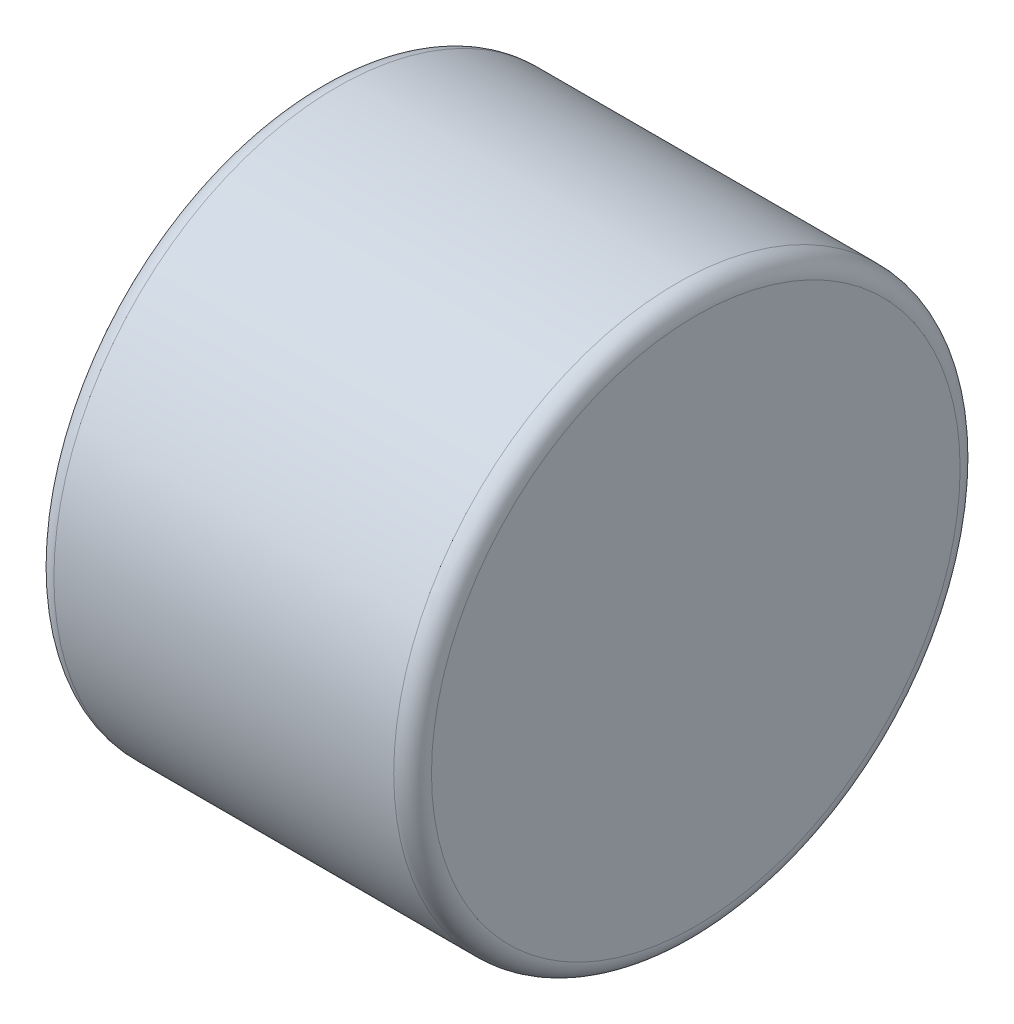
ISO-10303-21;
HEADER;
FILE_DESCRIPTION(('STEP AP214'),'2;1');
FILE_NAME('part.step','',(''),(''),'','','');
FILE_SCHEMA(('AUTOMOTIVE_DESIGN { 1 0 10303 214 1 1 1 1 }'));
ENDSEC;
DATA;
#1=APPLICATION_CONTEXT('core data for automotive mechanical design processes');
#2=APPLICATION_PROTOCOL_DEFINITION('international standard','automotive_design',2000,#1);
#3=PRODUCT_CONTEXT('',#1,'mechanical');
#4=PRODUCT('Part','Part','',(#3));
#5=PRODUCT_RELATED_PRODUCT_CATEGORY('part','',(#4));
#6=PRODUCT_DEFINITION_FORMATION('','',#4);
#7=PRODUCT_DEFINITION_CONTEXT('part definition',#1,'design');
#8=PRODUCT_DEFINITION('design','',#6,#7);
#9=PRODUCT_DEFINITION_SHAPE('','',#8);
#10=(LENGTH_UNIT() NAMED_UNIT(*) SI_UNIT(.MILLI.,.METRE.));
#11=(NAMED_UNIT(*) PLANE_ANGLE_UNIT() SI_UNIT($,.RADIAN.));
#12=(NAMED_UNIT(*) SI_UNIT($,.STERADIAN.) SOLID_ANGLE_UNIT());
#13=UNCERTAINTY_MEASURE_WITH_UNIT(LENGTH_MEASURE(1.E-05),#10,'distance_accuracy_value','');
#14=(GEOMETRIC_REPRESENTATION_CONTEXT(3) GLOBAL_UNCERTAINTY_ASSIGNED_CONTEXT((#13)) GLOBAL_UNIT_ASSIGNED_CONTEXT((#10,
#11,#12)) REPRESENTATION_CONTEXT('',''));
#15=CARTESIAN_POINT('',(0.,0.,0.));
#16=DIRECTION('',(0.,0.,1.));
#17=DIRECTION('',(1.,0.,0.));
#18=AXIS2_PLACEMENT_3D('',#15,#16,#17);
#19=CARTESIAN_POINT('',(4.,0.,0.));
#20=DIRECTION('',(-1.,0.,0.));
#21=DIRECTION('',(0.,0.,1.));
#22=AXIS2_PLACEMENT_3D('',#19,#20,#21);
#23=CYLINDRICAL_SURFACE('',#22,3.);
#24=CARTESIAN_POINT('',(0.2,0.,0.));
#25=DIRECTION('',(1.,0.,0.));
#26=DIRECTION('',(0.,0.,-1.));
#27=AXIS2_PLACEMENT_3D('',#24,#25,#26);
#28=CIRCLE('',#27,3.);
#29=CARTESIAN_POINT('',(0.2,0.,-3.));
#30=VERTEX_POINT('',#29);
#31=EDGE_CURVE('E41',#30,#30,#28,.T.);
#32=ORIENTED_EDGE('',*,*,#31,.T.);
#33=EDGE_LOOP('',(#32));
#34=FACE_BOUND('',#33,.T.);
#35=CARTESIAN_POINT('',(3.8,0.,0.));
#36=DIRECTION('',(1.,0.,0.));
#37=DIRECTION('',(0.,0.,-1.));
#38=AXIS2_PLACEMENT_3D('',#35,#36,#37);
#39=CIRCLE('',#38,3.);
#40=CARTESIAN_POINT('',(3.8,0.,-3.));
#41=VERTEX_POINT('',#40);
#42=EDGE_CURVE('E45',#41,#41,#39,.F.);
#43=ORIENTED_EDGE('',*,*,#42,.T.);
#44=EDGE_LOOP('',(#43));
#45=FACE_BOUND('',#44,.T.);
#46=ADVANCED_FACE('F30',(#34,#45),#23,.T.);
#47=CARTESIAN_POINT('',(4.,0.,0.));
#48=DIRECTION('',(1.,0.,0.));
#49=DIRECTION('',(0.,0.,-1.));
#50=AXIS2_PLACEMENT_3D('',#47,#48,#49);
#51=PLANE('',#50);
#52=CARTESIAN_POINT('',(4.,0.,0.));
#53=DIRECTION('',(1.,0.,0.));
#54=DIRECTION('',(0.,0.,-1.));
#55=AXIS2_PLACEMENT_3D('',#52,#53,#54);
#56=CIRCLE('',#55,2.8);
#57=CARTESIAN_POINT('',(4.,0.,-2.8));
#58=VERTEX_POINT('',#57);
#59=EDGE_CURVE('E10',#58,#58,#56,.T.);
#60=ORIENTED_EDGE('',*,*,#59,.T.);
#61=EDGE_LOOP('',(#60));
#62=FACE_BOUND('',#61,.T.);
#63=ADVANCED_FACE('F61',(#62),#51,.T.);
#64=CARTESIAN_POINT('',(0.,0.,0.));
#65=DIRECTION('',(1.,0.,0.));
#66=DIRECTION('',(0.,0.,-1.));
#67=AXIS2_PLACEMENT_3D('',#64,#65,#66);
#68=PLANE('',#67);
#69=CARTESIAN_POINT('',(0.,0.,0.));
#70=DIRECTION('',(1.,0.,0.));
#71=DIRECTION('',(0.,0.,-1.));
#72=AXIS2_PLACEMENT_3D('',#69,#70,#71);
#73=CIRCLE('',#72,2.8);
#74=CARTESIAN_POINT('',(0.,0.,-2.8));
#75=VERTEX_POINT('',#74);
#76=EDGE_CURVE('E37',#75,#75,#73,.F.);
#77=ORIENTED_EDGE('',*,*,#76,.T.);
#78=EDGE_LOOP('',(#77));
#79=FACE_BOUND('',#78,.T.);
#80=ADVANCED_FACE('F58',(#79),#68,.F.);
#81=CARTESIAN_POINT('',(0.2,0.,0.));
#82=DIRECTION('',(1.,0.,0.));
#83=DIRECTION('',(0.,0.,-1.));
#84=AXIS2_PLACEMENT_3D('',#81,#82,#83);
#85=TOROIDAL_SURFACE('',#84,2.8,0.2);
#86=ORIENTED_EDGE('',*,*,#76,.F.);
#87=EDGE_LOOP('',(#86));
#88=FACE_BOUND('',#87,.T.);
#89=ORIENTED_EDGE('',*,*,#31,.F.);
#90=EDGE_LOOP('',(#89));
#91=FACE_BOUND('',#90,.T.);
#92=ADVANCED_FACE('F54',(#88,#91),#85,.T.);
#93=CARTESIAN_POINT('',(3.8,0.,0.));
#94=DIRECTION('',(1.,0.,0.));
#95=DIRECTION('',(0.,0.,-1.));
#96=AXIS2_PLACEMENT_3D('',#93,#94,#95);
#97=TOROIDAL_SURFACE('',#96,2.8,0.2);
#98=ORIENTED_EDGE('',*,*,#42,.F.);
#99=EDGE_LOOP('',(#98));
#100=FACE_BOUND('',#99,.T.);
#101=ORIENTED_EDGE('',*,*,#59,.F.);
#102=EDGE_LOOP('',(#101));
#103=FACE_BOUND('',#102,.T.);
#104=ADVANCED_FACE('F32',(#100,#103),#97,.T.);
#105=CLOSED_SHELL('',(#46,#63,#80,#92,#104));
#106=MANIFOLD_SOLID_BREP('B2',#105);
#107=ADVANCED_BREP_SHAPE_REPRESENTATION('',(#18,#106),#14);
#108=SHAPE_DEFINITION_REPRESENTATION(#9,#107);
ENDSEC;
END-ISO-10303-21;
